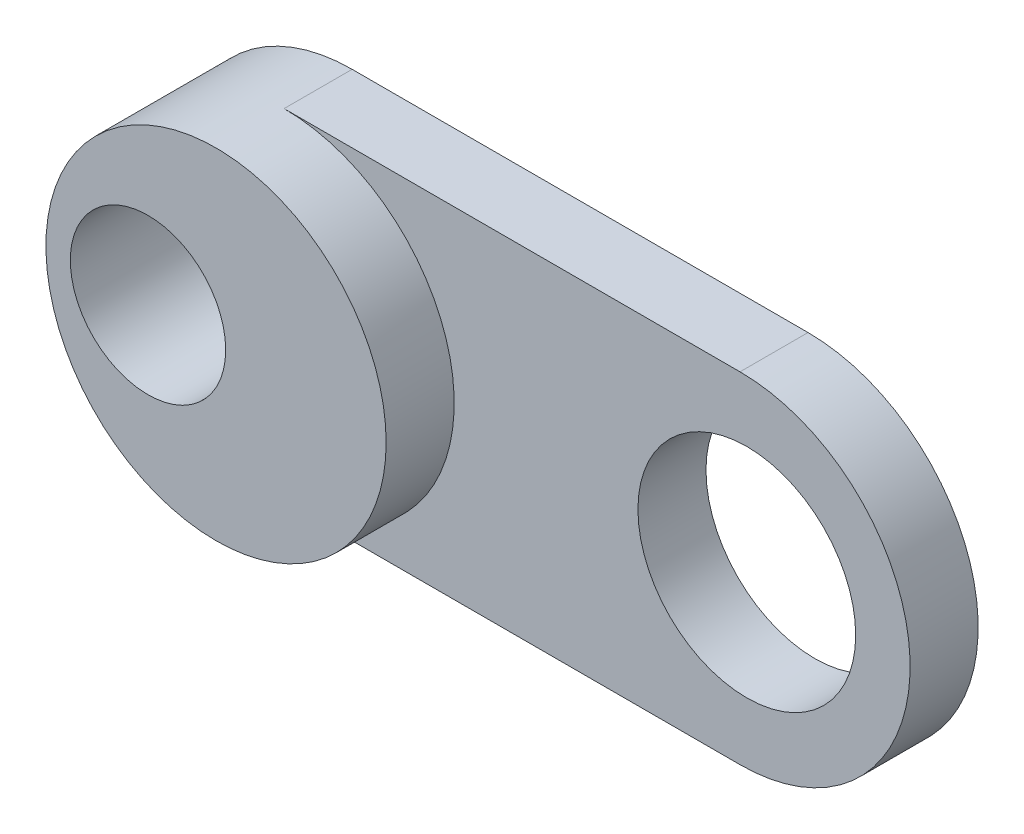
ISO-10303-21;
HEADER;
FILE_DESCRIPTION(('STEP AP214'),'2;1');
FILE_NAME('part.step','',(''),(''),'','','');
FILE_SCHEMA(('AUTOMOTIVE_DESIGN { 1 0 10303 214 1 1 1 1 }'));
ENDSEC;
DATA;
#1=APPLICATION_CONTEXT('core data for automotive mechanical design processes');
#2=APPLICATION_PROTOCOL_DEFINITION('international standard','automotive_design',2000,#1);
#3=PRODUCT_CONTEXT('',#1,'mechanical');
#4=PRODUCT('Part','Part','',(#3));
#5=PRODUCT_RELATED_PRODUCT_CATEGORY('part','',(#4));
#6=PRODUCT_DEFINITION_FORMATION('','',#4);
#7=PRODUCT_DEFINITION_CONTEXT('part definition',#1,'design');
#8=PRODUCT_DEFINITION('design','',#6,#7);
#9=PRODUCT_DEFINITION_SHAPE('','',#8);
#10=(LENGTH_UNIT() NAMED_UNIT(*) SI_UNIT(.MILLI.,.METRE.));
#11=(NAMED_UNIT(*) PLANE_ANGLE_UNIT() SI_UNIT($,.RADIAN.));
#12=(NAMED_UNIT(*) SI_UNIT($,.STERADIAN.) SOLID_ANGLE_UNIT());
#13=UNCERTAINTY_MEASURE_WITH_UNIT(LENGTH_MEASURE(1.E-05),#10,'distance_accuracy_value','');
#14=(GEOMETRIC_REPRESENTATION_CONTEXT(3) GLOBAL_UNCERTAINTY_ASSIGNED_CONTEXT((#13)) GLOBAL_UNIT_ASSIGNED_CONTEXT((#10,
#11,#12)) REPRESENTATION_CONTEXT('',''));
#15=CARTESIAN_POINT('',(0.,0.,0.));
#16=DIRECTION('',(0.,0.,1.));
#17=DIRECTION('',(1.,0.,0.));
#18=AXIS2_PLACEMENT_3D('',#15,#16,#17);
#19=CARTESIAN_POINT('',(0.,6.35,2.54));
#20=DIRECTION('',(0.,0.,-1.));
#21=DIRECTION('',(-1.,0.,0.));
#22=AXIS2_PLACEMENT_3D('',#19,#20,#21);
#23=PLANE('',#22);
#24=CARTESIAN_POINT('',(0.,6.35,2.54));
#25=DIRECTION('',(0.,0.,1.));
#26=DIRECTION('',(1.,0.,0.));
#27=AXIS2_PLACEMENT_3D('',#24,#25,#26);
#28=CIRCLE('',#27,6.35);
#29=CARTESIAN_POINT('',(0.,0.,2.54));
#30=VERTEX_POINT('',#29);
#31=CARTESIAN_POINT('',(0.,12.7,2.54));
#32=VERTEX_POINT('',#31);
#33=EDGE_CURVE('E11',#30,#32,#28,.T.);
#34=ORIENTED_EDGE('',*,*,#33,.F.);
#35=DIRECTION('',(1.,0.,0.));
#36=VECTOR('',#35,1.);
#37=CARTESIAN_POINT('',(0.,0.,2.54));
#38=LINE('',#37,#36);
#39=CARTESIAN_POINT('',(17.018,0.,2.54));
#40=VERTEX_POINT('',#39);
#41=EDGE_CURVE('E111',#30,#40,#38,.T.);
#42=ORIENTED_EDGE('',*,*,#41,.T.);
#43=CARTESIAN_POINT('',(17.018,6.35,2.54));
#44=DIRECTION('',(0.,0.,1.));
#45=DIRECTION('',(-1.,0.,0.));
#46=AXIS2_PLACEMENT_3D('',#43,#44,#45);
#47=CIRCLE('',#46,6.35);
#48=CARTESIAN_POINT('',(17.018,12.7,2.54));
#49=VERTEX_POINT('',#48);
#50=EDGE_CURVE('E62',#40,#49,#47,.T.);
#51=ORIENTED_EDGE('',*,*,#50,.T.);
#52=DIRECTION('',(-1.,0.,0.));
#53=VECTOR('',#52,1.);
#54=CARTESIAN_POINT('',(0.,12.7,2.54));
#55=LINE('',#54,#53);
#56=EDGE_CURVE('E93',#49,#32,#55,.T.);
#57=ORIENTED_EDGE('',*,*,#56,.T.);
#58=EDGE_LOOP('',(#34,#42,#51,#57));
#59=FACE_BOUND('',#58,.T.);
#60=CARTESIAN_POINT('',(17.272,6.35,2.54));
#61=DIRECTION('',(0.,0.,1.));
#62=DIRECTION('',(1.,0.,0.));
#63=AXIS2_PLACEMENT_3D('',#60,#61,#62);
#64=CIRCLE('',#63,4.064);
#65=CARTESIAN_POINT('',(21.336,6.35,2.54));
#66=VERTEX_POINT('',#65);
#67=EDGE_CURVE('E115',#66,#66,#64,.T.);
#68=ORIENTED_EDGE('',*,*,#67,.F.);
#69=EDGE_LOOP('',(#68));
#70=FACE_BOUND('',#69,.T.);
#71=ADVANCED_FACE('F44',(#59,#70),#23,.F.);
#72=CARTESIAN_POINT('',(0.,6.35,0.));
#73=DIRECTION('',(0.,0.,-1.));
#74=DIRECTION('',(-1.,0.,0.));
#75=AXIS2_PLACEMENT_3D('',#72,#73,#74);
#76=PLANE('',#75);
#77=CARTESIAN_POINT('',(17.272,6.35,0.));
#78=DIRECTION('',(0.,0.,1.));
#79=DIRECTION('',(1.,0.,0.));
#80=AXIS2_PLACEMENT_3D('',#77,#78,#79);
#81=CIRCLE('',#80,4.064);
#82=CARTESIAN_POINT('',(21.336,6.35,0.));
#83=VERTEX_POINT('',#82);
#84=EDGE_CURVE('E119',#83,#83,#81,.T.);
#85=ORIENTED_EDGE('',*,*,#84,.T.);
#86=EDGE_LOOP('',(#85));
#87=FACE_BOUND('',#86,.T.);
#88=CARTESIAN_POINT('',(0.,6.35,0.));
#89=DIRECTION('',(0.,0.,1.));
#90=DIRECTION('',(-1.,0.,0.));
#91=AXIS2_PLACEMENT_3D('',#88,#89,#90);
#92=CIRCLE('',#91,6.35);
#93=CARTESIAN_POINT('',(0.,12.7,0.));
#94=VERTEX_POINT('',#93);
#95=CARTESIAN_POINT('',(0.,0.,0.));
#96=VERTEX_POINT('',#95);
#97=EDGE_CURVE('E104',#94,#96,#92,.T.);
#98=ORIENTED_EDGE('',*,*,#97,.F.);
#99=DIRECTION('',(-1.,0.,0.));
#100=VECTOR('',#99,1.);
#101=CARTESIAN_POINT('',(0.,12.7,0.));
#102=LINE('',#101,#100);
#103=CARTESIAN_POINT('',(17.018,12.7,0.));
#104=VERTEX_POINT('',#103);
#105=EDGE_CURVE('E85',#104,#94,#102,.T.);
#106=ORIENTED_EDGE('',*,*,#105,.F.);
#107=CARTESIAN_POINT('',(17.018,6.35,0.));
#108=DIRECTION('',(0.,0.,1.));
#109=DIRECTION('',(-1.,0.,0.));
#110=AXIS2_PLACEMENT_3D('',#107,#108,#109);
#111=CIRCLE('',#110,6.35);
#112=CARTESIAN_POINT('',(17.018,0.,0.));
#113=VERTEX_POINT('',#112);
#114=EDGE_CURVE('E79',#113,#104,#111,.T.);
#115=ORIENTED_EDGE('',*,*,#114,.F.);
#116=DIRECTION('',(1.,0.,0.));
#117=VECTOR('',#116,1.);
#118=CARTESIAN_POINT('',(0.,0.,0.));
#119=LINE('',#118,#117);
#120=EDGE_CURVE('E113',#96,#113,#119,.T.);
#121=ORIENTED_EDGE('',*,*,#120,.F.);
#122=EDGE_LOOP('',(#98,#106,#115,#121));
#123=FACE_BOUND('',#122,.T.);
#124=CARTESIAN_POINT('',(-2.54,6.35,0.));
#125=DIRECTION('',(0.,0.,1.));
#126=DIRECTION('',(1.,0.,0.));
#127=AXIS2_PLACEMENT_3D('',#124,#125,#126);
#128=CIRCLE('',#127,2.9);
#129=CARTESIAN_POINT('',(0.36,6.35,0.));
#130=VERTEX_POINT('',#129);
#131=EDGE_CURVE('E122',#130,#130,#128,.T.);
#132=ORIENTED_EDGE('',*,*,#131,.T.);
#133=EDGE_LOOP('',(#132));
#134=FACE_BOUND('',#133,.T.);
#135=ADVANCED_FACE('F151',(#87,#123,#134),#76,.T.);
#136=CARTESIAN_POINT('',(0.,6.35,2.54));
#137=DIRECTION('',(0.,0.,-1.));
#138=DIRECTION('',(-1.,0.,0.));
#139=AXIS2_PLACEMENT_3D('',#136,#137,#138);
#140=CYLINDRICAL_SURFACE('',#139,6.35);
#141=ORIENTED_EDGE('',*,*,#97,.T.);
#142=DIRECTION('',(0.,0.,-1.));
#143=VECTOR('',#142,1.);
#144=CARTESIAN_POINT('',(0.,0.,2.54));
#145=LINE('',#144,#143);
#146=EDGE_CURVE('E48',#30,#96,#145,.T.);
#147=ORIENTED_EDGE('',*,*,#146,.F.);
#148=ORIENTED_EDGE('',*,*,#33,.T.);
#149=DIRECTION('',(0.,0.,-1.));
#150=VECTOR('',#149,1.);
#151=CARTESIAN_POINT('',(0.,12.7,2.54));
#152=LINE('',#151,#150);
#153=EDGE_CURVE('E91',#32,#94,#152,.T.);
#154=ORIENTED_EDGE('',*,*,#153,.T.);
#155=EDGE_LOOP('',(#141,#147,#148,#154));
#156=FACE_BOUND('',#155,.T.);
#157=CARTESIAN_POINT('',(0.,6.35,5.08));
#158=DIRECTION('',(0.,0.,1.));
#159=DIRECTION('',(1.,0.,0.));
#160=AXIS2_PLACEMENT_3D('',#157,#158,#159);
#161=CIRCLE('',#160,6.35);
#162=CARTESIAN_POINT('',(6.35,6.35,5.08));
#163=VERTEX_POINT('',#162);
#164=EDGE_CURVE('E126',#163,#163,#161,.T.);
#165=ORIENTED_EDGE('',*,*,#164,.F.);
#166=EDGE_LOOP('',(#165));
#167=FACE_BOUND('',#166,.T.);
#168=ADVANCED_FACE('F46',(#156,#167),#140,.T.);
#169=CARTESIAN_POINT('',(0.,0.,2.54));
#170=DIRECTION('',(0.,1.,0.));
#171=DIRECTION('',(-1.,0.,0.));
#172=AXIS2_PLACEMENT_3D('',#169,#170,#171);
#173=PLANE('',#172);
#174=ORIENTED_EDGE('',*,*,#120,.T.);
#175=DIRECTION('',(0.,0.,-1.));
#176=VECTOR('',#175,1.);
#177=CARTESIAN_POINT('',(17.018,0.,2.54));
#178=LINE('',#177,#176);
#179=EDGE_CURVE('E106',#40,#113,#178,.T.);
#180=ORIENTED_EDGE('',*,*,#179,.F.);
#181=ORIENTED_EDGE('',*,*,#41,.F.);
#182=ORIENTED_EDGE('',*,*,#146,.T.);
#183=EDGE_LOOP('',(#174,#180,#181,#182));
#184=FACE_BOUND('',#183,.T.);
#185=ADVANCED_FACE('F163',(#184),#173,.F.);
#186=CARTESIAN_POINT('',(17.018,6.35,2.54));
#187=DIRECTION('',(0.,0.,-1.));
#188=DIRECTION('',(-1.,0.,0.));
#189=AXIS2_PLACEMENT_3D('',#186,#187,#188);
#190=CYLINDRICAL_SURFACE('',#189,6.35);
#191=ORIENTED_EDGE('',*,*,#114,.T.);
#192=DIRECTION('',(0.,0.,-1.));
#193=VECTOR('',#192,1.);
#194=CARTESIAN_POINT('',(17.018,12.7,2.54));
#195=LINE('',#194,#193);
#196=EDGE_CURVE('E97',#49,#104,#195,.T.);
#197=ORIENTED_EDGE('',*,*,#196,.F.);
#198=ORIENTED_EDGE('',*,*,#50,.F.);
#199=ORIENTED_EDGE('',*,*,#179,.T.);
#200=EDGE_LOOP('',(#191,#197,#198,#199));
#201=FACE_BOUND('',#200,.T.);
#202=ADVANCED_FACE('F161',(#201),#190,.T.);
#203=CARTESIAN_POINT('',(0.,12.7,2.54));
#204=DIRECTION('',(0.,-1.,0.));
#205=DIRECTION('',(1.,0.,0.));
#206=AXIS2_PLACEMENT_3D('',#203,#204,#205);
#207=PLANE('',#206);
#208=ORIENTED_EDGE('',*,*,#105,.T.);
#209=ORIENTED_EDGE('',*,*,#153,.F.);
#210=ORIENTED_EDGE('',*,*,#56,.F.);
#211=ORIENTED_EDGE('',*,*,#196,.T.);
#212=EDGE_LOOP('',(#208,#209,#210,#211));
#213=FACE_BOUND('',#212,.T.);
#214=ADVANCED_FACE('F92',(#213),#207,.F.);
#215=CARTESIAN_POINT('',(17.272,6.35,2.54));
#216=DIRECTION('',(0.,0.,-1.));
#217=DIRECTION('',(-1.,0.,0.));
#218=AXIS2_PLACEMENT_3D('',#215,#216,#217);
#219=CYLINDRICAL_SURFACE('',#218,4.064);
#220=ORIENTED_EDGE('',*,*,#67,.T.);
#221=EDGE_LOOP('',(#220));
#222=FACE_BOUND('',#221,.T.);
#223=ORIENTED_EDGE('',*,*,#84,.F.);
#224=EDGE_LOOP('',(#223));
#225=FACE_BOUND('',#224,.T.);
#226=ADVANCED_FACE('F139',(#222,#225),#219,.F.);
#227=CARTESIAN_POINT('',(-2.54,6.35,2.54));
#228=DIRECTION('',(0.,0.,-1.));
#229=DIRECTION('',(-1.,0.,0.));
#230=AXIS2_PLACEMENT_3D('',#227,#228,#229);
#231=CYLINDRICAL_SURFACE('',#230,2.9);
#232=ORIENTED_EDGE('',*,*,#131,.F.);
#233=EDGE_LOOP('',(#232));
#234=FACE_BOUND('',#233,.T.);
#235=CARTESIAN_POINT('',(-2.54,6.35,5.08));
#236=DIRECTION('',(0.,0.,1.));
#237=DIRECTION('',(1.,0.,0.));
#238=AXIS2_PLACEMENT_3D('',#235,#236,#237);
#239=CIRCLE('',#238,2.9);
#240=CARTESIAN_POINT('',(0.36,6.35,5.08));
#241=VERTEX_POINT('',#240);
#242=EDGE_CURVE('E130',#241,#241,#239,.F.);
#243=ORIENTED_EDGE('',*,*,#242,.F.);
#244=EDGE_LOOP('',(#243));
#245=FACE_BOUND('',#244,.T.);
#246=ADVANCED_FACE('F137',(#234,#245),#231,.F.);
#247=CARTESIAN_POINT('',(0.,0.,5.08));
#248=DIRECTION('',(0.,0.,1.));
#249=DIRECTION('',(1.,0.,0.));
#250=AXIS2_PLACEMENT_3D('',#247,#248,#249);
#251=PLANE('',#250);
#252=ORIENTED_EDGE('',*,*,#242,.T.);
#253=EDGE_LOOP('',(#252));
#254=FACE_BOUND('',#253,.T.);
#255=ORIENTED_EDGE('',*,*,#164,.T.);
#256=EDGE_LOOP('',(#255));
#257=FACE_BOUND('',#256,.T.);
#258=ADVANCED_FACE('F134',(#254,#257),#251,.T.);
#259=CLOSED_SHELL('',(#71,#135,#168,#185,#202,#214,#226,#246,#258));
#260=MANIFOLD_SOLID_BREP('B2',#259);
#261=ADVANCED_BREP_SHAPE_REPRESENTATION('',(#18,#260),#14);
#262=SHAPE_DEFINITION_REPRESENTATION(#9,#261);
ENDSEC;
END-ISO-10303-21;
